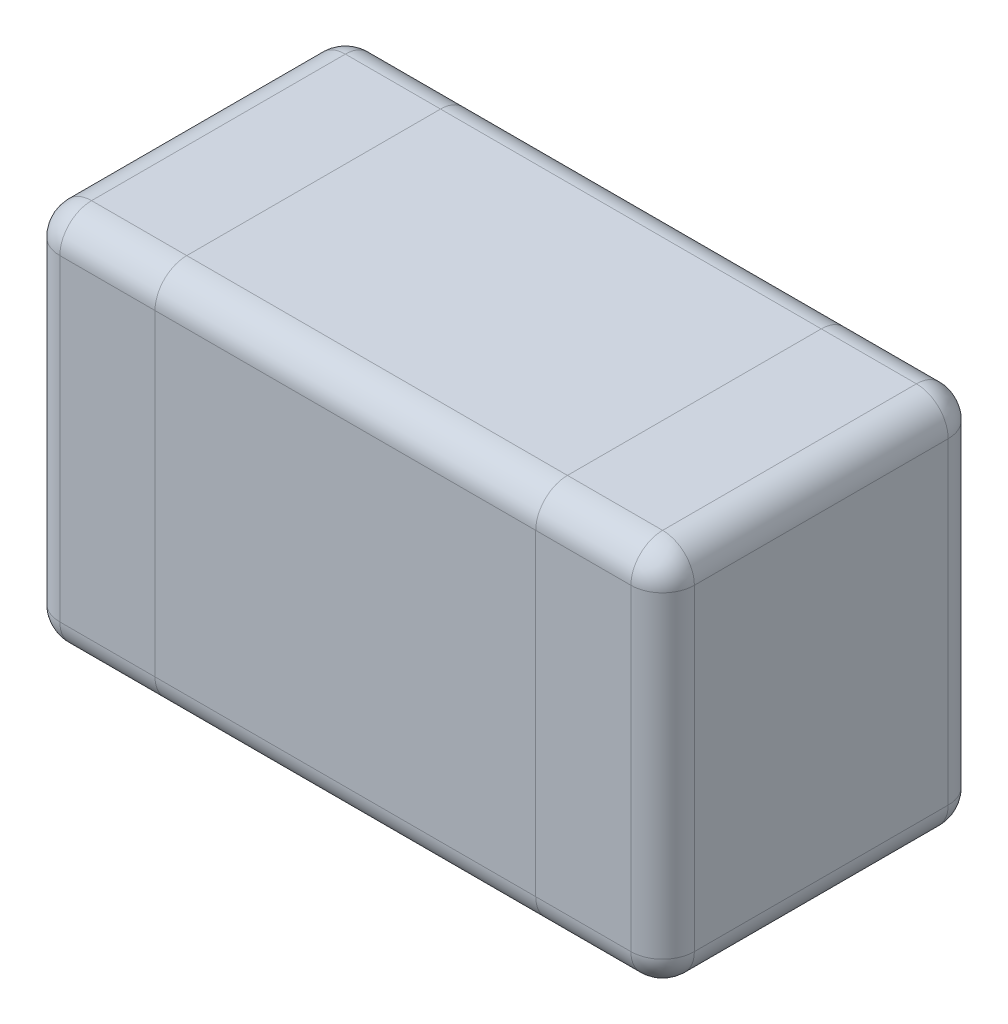
ISO-10303-21;
HEADER;
FILE_DESCRIPTION(('STEP AP214'),'2;1');
FILE_NAME('part.step','',(''),(''),'','','');
FILE_SCHEMA(('AUTOMOTIVE_DESIGN { 1 0 10303 214 1 1 1 1 }'));
ENDSEC;
DATA;
#1=APPLICATION_CONTEXT('core data for automotive mechanical design processes');
#2=APPLICATION_PROTOCOL_DEFINITION('international standard','automotive_design',2000,#1);
#3=PRODUCT_CONTEXT('',#1,'mechanical');
#4=PRODUCT('Part','Part','',(#3));
#5=PRODUCT_RELATED_PRODUCT_CATEGORY('part','',(#4));
#6=PRODUCT_DEFINITION_FORMATION('','',#4);
#7=PRODUCT_DEFINITION_CONTEXT('part definition',#1,'design');
#8=PRODUCT_DEFINITION('design','',#6,#7);
#9=PRODUCT_DEFINITION_SHAPE('','',#8);
#10=(LENGTH_UNIT() NAMED_UNIT(*) SI_UNIT(.MILLI.,.METRE.));
#11=(NAMED_UNIT(*) PLANE_ANGLE_UNIT() SI_UNIT($,.RADIAN.));
#12=(NAMED_UNIT(*) SI_UNIT($,.STERADIAN.) SOLID_ANGLE_UNIT());
#13=UNCERTAINTY_MEASURE_WITH_UNIT(LENGTH_MEASURE(1.E-05),#10,'distance_accuracy_value','');
#14=(GEOMETRIC_REPRESENTATION_CONTEXT(3) GLOBAL_UNCERTAINTY_ASSIGNED_CONTEXT((#13)) GLOBAL_UNIT_ASSIGNED_CONTEXT((#10,
#11,#12)) REPRESENTATION_CONTEXT('',''));
#15=CARTESIAN_POINT('',(0.,0.,0.));
#16=DIRECTION('',(0.,0.,1.));
#17=DIRECTION('',(1.,0.,0.));
#18=AXIS2_PLACEMENT_3D('',#15,#16,#17);
#19=CARTESIAN_POINT('',(0.500000000000004,0.6,-0.250000000000002));
#20=DIRECTION('',(0.,-1.,0.));
#21=DIRECTION('',(0.,0.,-1.));
#22=AXIS2_PLACEMENT_3D('',#19,#20,#21);
#23=PLANE('',#22);
#24=DIRECTION('',(0.,0.,1.));
#25=VECTOR('',#24,1.);
#26=CARTESIAN_POINT('',(-0.299999999999996,0.6,-0.250000000000002));
#27=LINE('',#26,#25);
#28=CARTESIAN_POINT('',(-0.299999999999996,0.6,-0.200000000000002));
#29=VERTEX_POINT('',#28);
#30=CARTESIAN_POINT('',(-0.299999999999996,0.6,0.199999999999998));
#31=VERTEX_POINT('',#30);
#32=EDGE_CURVE('E11',#29,#31,#27,.T.);
#33=ORIENTED_EDGE('',*,*,#32,.F.);
#34=DIRECTION('',(-1.,0.,0.));
#35=VECTOR('',#34,1.);
#36=CARTESIAN_POINT('',(0.500000000000004,0.6,-0.200000000000002));
#37=LINE('',#36,#35);
#38=CARTESIAN_POINT('',(-0.449999999999996,0.6,-0.200000000000002));
#39=VERTEX_POINT('',#38);
#40=EDGE_CURVE('E254',#29,#39,#37,.T.);
#41=ORIENTED_EDGE('',*,*,#40,.T.);
#42=DIRECTION('',(0.,0.,1.));
#43=VECTOR('',#42,1.);
#44=CARTESIAN_POINT('',(-0.449999999999996,0.6,-0.250000000000002));
#45=LINE('',#44,#43);
#46=CARTESIAN_POINT('',(-0.449999999999996,0.6,0.199999999999998));
#47=VERTEX_POINT('',#46);
#48=EDGE_CURVE('E257',#39,#47,#45,.T.);
#49=ORIENTED_EDGE('',*,*,#48,.T.);
#50=DIRECTION('',(1.,0.,0.));
#51=VECTOR('',#50,1.);
#52=CARTESIAN_POINT('',(0.500000000000004,0.6,0.199999999999998));
#53=LINE('',#52,#51);
#54=EDGE_CURVE('E261',#47,#31,#53,.T.);
#55=ORIENTED_EDGE('',*,*,#54,.T.);
#56=EDGE_LOOP('',(#33,#41,#49,#55));
#57=FACE_BOUND('',#56,.T.);
#58=ADVANCED_FACE('F38',(#57),#23,.F.);
#59=DIRECTION('',(0.,0.,-1.));
#60=VECTOR('',#59,1.);
#61=CARTESIAN_POINT('',(0.299999999999996,0.6,-0.250000000000002));
#62=LINE('',#61,#60);
#63=CARTESIAN_POINT('',(0.299999999999996,0.6,0.199999999999998));
#64=VERTEX_POINT('',#63);
#65=CARTESIAN_POINT('',(0.299999999999996,0.6,-0.200000000000002));
#66=VERTEX_POINT('',#65);
#67=EDGE_CURVE('E48',#64,#66,#62,.T.);
#68=ORIENTED_EDGE('',*,*,#67,.F.);
#69=CARTESIAN_POINT('',(0.450000000000004,0.6,0.199999999999998));
#70=VERTEX_POINT('',#69);
#71=EDGE_CURVE('E260',#64,#70,#53,.T.);
#72=ORIENTED_EDGE('',*,*,#71,.T.);
#73=DIRECTION('',(0.,0.,-1.));
#74=VECTOR('',#73,1.);
#75=CARTESIAN_POINT('',(0.450000000000004,0.6,-0.250000000000002));
#76=LINE('',#75,#74);
#77=CARTESIAN_POINT('',(0.450000000000004,0.6,-0.200000000000002));
#78=VERTEX_POINT('',#77);
#79=EDGE_CURVE('E251',#70,#78,#76,.T.);
#80=ORIENTED_EDGE('',*,*,#79,.T.);
#81=EDGE_CURVE('E255',#78,#66,#37,.T.);
#82=ORIENTED_EDGE('',*,*,#81,.T.);
#83=EDGE_LOOP('',(#68,#72,#80,#82));
#84=FACE_BOUND('',#83,.T.);
#85=ADVANCED_FACE('F527',(#84),#23,.F.);
#86=CARTESIAN_POINT('',(0.500000000000004,0.55,0.199999999999998));
#87=DIRECTION('',(1.,0.,0.));
#88=DIRECTION('',(0.,0.,-1.));
#89=AXIS2_PLACEMENT_3D('',#86,#87,#88);
#90=CYLINDRICAL_SURFACE('',#89,0.05);
#91=DIRECTION('',(1.,0.,0.));
#92=VECTOR('',#91,1.);
#93=CARTESIAN_POINT('',(-0.499999999999996,0.55,0.249999999999999));
#94=LINE('',#93,#92);
#95=CARTESIAN_POINT('',(-0.299999999999996,0.55,0.249999999999999));
#96=VERTEX_POINT('',#95);
#97=CARTESIAN_POINT('',(-0.449999999999996,0.55,0.249999999999999));
#98=VERTEX_POINT('',#97);
#99=EDGE_CURVE('E247',#96,#98,#94,.F.);
#100=ORIENTED_EDGE('',*,*,#99,.F.);
#101=CARTESIAN_POINT('',(-0.299999999999996,0.55,0.199999999999998));
#102=DIRECTION('',(1.,0.,0.));
#103=DIRECTION('',(0.,0.,-1.));
#104=AXIS2_PLACEMENT_3D('',#101,#102,#103);
#105=CIRCLE('',#104,0.05);
#106=EDGE_CURVE('E355',#96,#31,#105,.F.);
#107=ORIENTED_EDGE('',*,*,#106,.T.);
#108=ORIENTED_EDGE('',*,*,#54,.F.);
#109=CARTESIAN_POINT('',(-0.449999999999996,0.55,0.199999999999998));
#110=DIRECTION('',(-1.,0.,0.));
#111=DIRECTION('',(0.,0.,1.));
#112=AXIS2_PLACEMENT_3D('',#109,#110,#111);
#113=CIRCLE('',#112,0.05);
#114=EDGE_CURVE('E331',#47,#98,#113,.F.);
#115=ORIENTED_EDGE('',*,*,#114,.T.);
#116=EDGE_LOOP('',(#100,#107,#108,#115));
#117=FACE_BOUND('',#116,.T.);
#118=ADVANCED_FACE('F484',(#117),#90,.T.);
#119=ORIENTED_EDGE('',*,*,#71,.F.);
#120=CARTESIAN_POINT('',(0.299999999999996,0.55,0.199999999999998));
#121=DIRECTION('',(-1.,0.,0.));
#122=DIRECTION('',(0.,0.,1.));
#123=AXIS2_PLACEMENT_3D('',#120,#121,#122);
#124=CIRCLE('',#123,0.05);
#125=CARTESIAN_POINT('',(0.299999999999996,0.55,0.249999999999999));
#126=VERTEX_POINT('',#125);
#127=EDGE_CURVE('E354',#64,#126,#124,.F.);
#128=ORIENTED_EDGE('',*,*,#127,.T.);
#129=CARTESIAN_POINT('',(0.450000000000004,0.55,0.249999999999999));
#130=VERTEX_POINT('',#129);
#131=EDGE_CURVE('E248',#130,#126,#94,.F.);
#132=ORIENTED_EDGE('',*,*,#131,.F.);
#133=CARTESIAN_POINT('',(0.450000000000004,0.55,0.199999999999998));
#134=DIRECTION('',(1.,0.,0.));
#135=DIRECTION('',(0.,0.,-1.));
#136=AXIS2_PLACEMENT_3D('',#133,#134,#135);
#137=CIRCLE('',#136,0.05);
#138=EDGE_CURVE('E316',#70,#130,#137,.T.);
#139=ORIENTED_EDGE('',*,*,#138,.F.);
#140=EDGE_LOOP('',(#119,#128,#132,#139));
#141=FACE_BOUND('',#140,.T.);
#142=ADVANCED_FACE('F458',(#141),#90,.T.);
#143=CARTESIAN_POINT('',(-0.499999999999996,0.6,0.249999999999999));
#144=DIRECTION('',(0.,0.,-1.));
#145=DIRECTION('',(-1.,0.,0.));
#146=AXIS2_PLACEMENT_3D('',#143,#144,#145);
#147=PLANE('',#146);
#148=DIRECTION('',(0.,-1.,0.));
#149=VECTOR('',#148,1.);
#150=CARTESIAN_POINT('',(-0.299999999999996,0.6,0.249999999999999));
#151=LINE('',#150,#149);
#152=CARTESIAN_POINT('',(-0.299999999999996,0.05,0.249999999999999));
#153=VERTEX_POINT('',#152);
#154=EDGE_CURVE('E350',#96,#153,#151,.T.);
#155=ORIENTED_EDGE('',*,*,#154,.F.);
#156=ORIENTED_EDGE('',*,*,#99,.T.);
#157=DIRECTION('',(0.,-1.,0.));
#158=VECTOR('',#157,1.);
#159=CARTESIAN_POINT('',(-0.449999999999996,0.6,0.249999999999999));
#160=LINE('',#159,#158);
#161=CARTESIAN_POINT('',(-0.449999999999996,0.05,0.249999999999999));
#162=VERTEX_POINT('',#161);
#163=EDGE_CURVE('E244',#98,#162,#160,.T.);
#164=ORIENTED_EDGE('',*,*,#163,.T.);
#165=DIRECTION('',(1.,0.,0.));
#166=VECTOR('',#165,1.);
#167=CARTESIAN_POINT('',(0.500000000000004,0.05,0.249999999999999));
#168=LINE('',#167,#166);
#169=EDGE_CURVE('E238',#162,#153,#168,.T.);
#170=ORIENTED_EDGE('',*,*,#169,.T.);
#171=EDGE_LOOP('',(#155,#156,#164,#170));
#172=FACE_BOUND('',#171,.T.);
#173=ADVANCED_FACE('F472',(#172),#147,.F.);
#174=DIRECTION('',(0.,1.,0.));
#175=VECTOR('',#174,1.);
#176=CARTESIAN_POINT('',(0.299999999999996,0.6,0.249999999999999));
#177=LINE('',#176,#175);
#178=CARTESIAN_POINT('',(0.299999999999996,0.05,0.249999999999999));
#179=VERTEX_POINT('',#178);
#180=EDGE_CURVE('E346',#179,#126,#177,.T.);
#181=ORIENTED_EDGE('',*,*,#180,.F.);
#182=CARTESIAN_POINT('',(0.450000000000004,0.05,0.249999999999999));
#183=VERTEX_POINT('',#182);
#184=EDGE_CURVE('E237',#179,#183,#168,.T.);
#185=ORIENTED_EDGE('',*,*,#184,.T.);
#186=DIRECTION('',(0.,-1.,0.));
#187=VECTOR('',#186,1.);
#188=CARTESIAN_POINT('',(0.450000000000004,0.6,0.249999999999999));
#189=LINE('',#188,#187);
#190=EDGE_CURVE('E241',#183,#130,#189,.F.);
#191=ORIENTED_EDGE('',*,*,#190,.T.);
#192=ORIENTED_EDGE('',*,*,#131,.T.);
#193=EDGE_LOOP('',(#181,#185,#191,#192));
#194=FACE_BOUND('',#193,.T.);
#195=ADVANCED_FACE('F454',(#194),#147,.F.);
#196=CARTESIAN_POINT('',(-0.499999999999996,0.05,0.199999999999998));
#197=DIRECTION('',(-1.,0.,0.));
#198=DIRECTION('',(0.,0.,1.));
#199=AXIS2_PLACEMENT_3D('',#196,#197,#198);
#200=CYLINDRICAL_SURFACE('',#199,0.05);
#201=DIRECTION('',(1.,0.,0.));
#202=VECTOR('',#201,1.);
#203=CARTESIAN_POINT('',(-0.499999999999996,0.,0.199999999999998));
#204=LINE('',#203,#202);
#205=CARTESIAN_POINT('',(-0.299999999999996,0.,0.199999999999998));
#206=VERTEX_POINT('',#205);
#207=CARTESIAN_POINT('',(-0.449999999999996,0.,0.199999999999998));
#208=VERTEX_POINT('',#207);
#209=EDGE_CURVE('E267',#206,#208,#204,.F.);
#210=ORIENTED_EDGE('',*,*,#209,.F.);
#211=CARTESIAN_POINT('',(-0.299999999999996,0.05,0.199999999999998));
#212=DIRECTION('',(1.,0.,0.));
#213=DIRECTION('',(0.,0.,-1.));
#214=AXIS2_PLACEMENT_3D('',#211,#212,#213);
#215=CIRCLE('',#214,0.05);
#216=EDGE_CURVE('E351',#206,#153,#215,.F.);
#217=ORIENTED_EDGE('',*,*,#216,.T.);
#218=ORIENTED_EDGE('',*,*,#169,.F.);
#219=CARTESIAN_POINT('',(-0.449999999999996,0.05,0.199999999999998));
#220=DIRECTION('',(-1.,0.,0.));
#221=DIRECTION('',(0.,0.,1.));
#222=AXIS2_PLACEMENT_3D('',#219,#220,#221);
#223=CIRCLE('',#222,0.05);
#224=EDGE_CURVE('E322',#162,#208,#223,.F.);
#225=ORIENTED_EDGE('',*,*,#224,.T.);
#226=EDGE_LOOP('',(#210,#217,#218,#225));
#227=FACE_BOUND('',#226,.T.);
#228=ADVANCED_FACE('F510',(#227),#200,.T.);
#229=ORIENTED_EDGE('',*,*,#184,.F.);
#230=CARTESIAN_POINT('',(0.299999999999996,0.05,0.199999999999998));
#231=DIRECTION('',(-1.,0.,0.));
#232=DIRECTION('',(0.,0.,1.));
#233=AXIS2_PLACEMENT_3D('',#230,#231,#232);
#234=CIRCLE('',#233,0.05);
#235=CARTESIAN_POINT('',(0.299999999999996,0.,0.199999999999998));
#236=VERTEX_POINT('',#235);
#237=EDGE_CURVE('E366',#179,#236,#234,.F.);
#238=ORIENTED_EDGE('',*,*,#237,.T.);
#239=CARTESIAN_POINT('',(0.450000000000004,0.,0.199999999999998));
#240=VERTEX_POINT('',#239);
#241=EDGE_CURVE('E268',#240,#236,#204,.F.);
#242=ORIENTED_EDGE('',*,*,#241,.F.);
#243=CARTESIAN_POINT('',(0.450000000000004,0.05,0.199999999999998));
#244=DIRECTION('',(1.,0.,0.));
#245=DIRECTION('',(0.,0.,-1.));
#246=AXIS2_PLACEMENT_3D('',#243,#244,#245);
#247=CIRCLE('',#246,0.05);
#248=EDGE_CURVE('E302',#183,#240,#247,.T.);
#249=ORIENTED_EDGE('',*,*,#248,.F.);
#250=EDGE_LOOP('',(#229,#238,#242,#249));
#251=FACE_BOUND('',#250,.T.);
#252=ADVANCED_FACE('F444',(#251),#200,.T.);
#253=CARTESIAN_POINT('',(0.500000000000004,0.,-0.250000000000002));
#254=DIRECTION('',(0.,-1.,0.));
#255=DIRECTION('',(0.,0.,-1.));
#256=AXIS2_PLACEMENT_3D('',#253,#254,#255);
#257=PLANE('',#256);
#258=DIRECTION('',(-1.,0.,0.));
#259=VECTOR('',#258,1.);
#260=CARTESIAN_POINT('',(0.500000000000004,0.,-0.200000000000002));
#261=LINE('',#260,#259);
#262=CARTESIAN_POINT('',(-0.449999999999996,0.,-0.200000000000002));
#263=VERTEX_POINT('',#262);
#264=CARTESIAN_POINT('',(-0.299999999999996,0.,-0.200000000000002));
#265=VERTEX_POINT('',#264);
#266=EDGE_CURVE('E275',#263,#265,#261,.F.);
#267=ORIENTED_EDGE('',*,*,#266,.T.);
#268=DIRECTION('',(0.,0.,1.));
#269=VECTOR('',#268,1.);
#270=CARTESIAN_POINT('',(-0.299999999999996,0.,-0.250000000000002));
#271=LINE('',#270,#269);
#272=EDGE_CURVE('E367',#265,#206,#271,.T.);
#273=ORIENTED_EDGE('',*,*,#272,.T.);
#274=ORIENTED_EDGE('',*,*,#209,.T.);
#275=DIRECTION('',(0.,0.,1.));
#276=VECTOR('',#275,1.);
#277=CARTESIAN_POINT('',(-0.449999999999996,0.,-0.250000000000002));
#278=LINE('',#277,#276);
#279=EDGE_CURVE('E271',#208,#263,#278,.F.);
#280=ORIENTED_EDGE('',*,*,#279,.T.);
#281=EDGE_LOOP('',(#267,#273,#274,#280));
#282=FACE_BOUND('',#281,.T.);
#283=ADVANCED_FACE('F513',(#282),#257,.T.);
#284=ORIENTED_EDGE('',*,*,#241,.T.);
#285=DIRECTION('',(0.,0.,-1.));
#286=VECTOR('',#285,1.);
#287=CARTESIAN_POINT('',(0.299999999999996,0.,-0.250000000000002));
#288=LINE('',#287,#286);
#289=CARTESIAN_POINT('',(0.299999999999996,0.,-0.200000000000002));
#290=VERTEX_POINT('',#289);
#291=EDGE_CURVE('E361',#236,#290,#288,.T.);
#292=ORIENTED_EDGE('',*,*,#291,.T.);
#293=CARTESIAN_POINT('',(0.450000000000004,0.,-0.200000000000002));
#294=VERTEX_POINT('',#293);
#295=EDGE_CURVE('E274',#290,#294,#261,.F.);
#296=ORIENTED_EDGE('',*,*,#295,.T.);
#297=DIRECTION('',(0.,0.,-1.));
#298=VECTOR('',#297,1.);
#299=CARTESIAN_POINT('',(0.450000000000004,0.,0.249999999999999));
#300=LINE('',#299,#298);
#301=EDGE_CURVE('E264',#294,#240,#300,.F.);
#302=ORIENTED_EDGE('',*,*,#301,.T.);
#303=EDGE_LOOP('',(#284,#292,#296,#302));
#304=FACE_BOUND('',#303,.T.);
#305=ADVANCED_FACE('F388',(#304),#257,.T.);
#306=CARTESIAN_POINT('',(0.500000000000004,0.55,-0.200000000000002));
#307=DIRECTION('',(-1.,0.,0.));
#308=DIRECTION('',(0.,0.,1.));
#309=AXIS2_PLACEMENT_3D('',#306,#307,#308);
#310=CYLINDRICAL_SURFACE('',#309,0.05);
#311=ORIENTED_EDGE('',*,*,#40,.F.);
#312=CARTESIAN_POINT('',(-0.299999999999996,0.55,-0.200000000000002));
#313=DIRECTION('',(1.,0.,0.));
#314=DIRECTION('',(0.,0.,-1.));
#315=AXIS2_PLACEMENT_3D('',#312,#313,#314);
#316=CIRCLE('',#315,0.05);
#317=CARTESIAN_POINT('',(-0.299999999999996,0.55,-0.250000000000002));
#318=VERTEX_POINT('',#317);
#319=EDGE_CURVE('E358',#29,#318,#316,.F.);
#320=ORIENTED_EDGE('',*,*,#319,.T.);
#321=DIRECTION('',(-1.,0.,0.));
#322=VECTOR('',#321,1.);
#323=CARTESIAN_POINT('',(-0.499999999999996,0.55,-0.250000000000002));
#324=LINE('',#323,#322);
#325=CARTESIAN_POINT('',(-0.449999999999996,0.55,-0.250000000000002));
#326=VERTEX_POINT('',#325);
#327=EDGE_CURVE('E217',#326,#318,#324,.F.);
#328=ORIENTED_EDGE('',*,*,#327,.F.);
#329=CARTESIAN_POINT('',(-0.449999999999996,0.55,-0.200000000000002));
#330=DIRECTION('',(-1.,0.,0.));
#331=DIRECTION('',(0.,0.,1.));
#332=AXIS2_PLACEMENT_3D('',#329,#330,#331);
#333=CIRCLE('',#332,0.05);
#334=EDGE_CURVE('E293',#326,#39,#333,.F.);
#335=ORIENTED_EDGE('',*,*,#334,.T.);
#336=EDGE_LOOP('',(#311,#320,#328,#335));
#337=FACE_BOUND('',#336,.T.);
#338=ADVANCED_FACE('F520',(#337),#310,.T.);
#339=CARTESIAN_POINT('',(0.299999999999996,0.55,-0.250000000000002));
#340=VERTEX_POINT('',#339);
#341=CARTESIAN_POINT('',(0.450000000000004,0.55,-0.250000000000002));
#342=VERTEX_POINT('',#341);
#343=EDGE_CURVE('E212',#340,#342,#324,.F.);
#344=ORIENTED_EDGE('',*,*,#343,.F.);
#345=CARTESIAN_POINT('',(0.299999999999996,0.55,-0.200000000000002));
#346=DIRECTION('',(-1.,0.,0.));
#347=DIRECTION('',(0.,0.,1.));
#348=AXIS2_PLACEMENT_3D('',#345,#346,#347);
#349=CIRCLE('',#348,0.05);
#350=EDGE_CURVE('E362',#340,#66,#349,.F.);
#351=ORIENTED_EDGE('',*,*,#350,.T.);
#352=ORIENTED_EDGE('',*,*,#81,.F.);
#353=CARTESIAN_POINT('',(0.450000000000004,0.55,-0.200000000000002));
#354=DIRECTION('',(1.,0.,0.));
#355=DIRECTION('',(0.,0.,-1.));
#356=AXIS2_PLACEMENT_3D('',#353,#354,#355);
#357=CIRCLE('',#356,0.05);
#358=EDGE_CURVE('E197',#342,#78,#357,.T.);
#359=ORIENTED_EDGE('',*,*,#358,.F.);
#360=EDGE_LOOP('',(#344,#351,#352,#359));
#361=FACE_BOUND('',#360,.T.);
#362=ADVANCED_FACE('F423',(#361),#310,.T.);
#363=CARTESIAN_POINT('',(-0.499999999999996,0.05,-0.200000000000002));
#364=DIRECTION('',(1.,0.,0.));
#365=DIRECTION('',(0.,0.,-1.));
#366=AXIS2_PLACEMENT_3D('',#363,#364,#365);
#367=CYLINDRICAL_SURFACE('',#366,0.05);
#368=DIRECTION('',(-1.,0.,0.));
#369=VECTOR('',#368,1.);
#370=CARTESIAN_POINT('',(-0.499999999999996,0.05,-0.250000000000002));
#371=LINE('',#370,#369);
#372=CARTESIAN_POINT('',(-0.299999999999996,0.05,-0.250000000000002));
#373=VERTEX_POINT('',#372);
#374=CARTESIAN_POINT('',(-0.449999999999996,0.05,-0.250000000000002));
#375=VERTEX_POINT('',#374);
#376=EDGE_CURVE('E209',#373,#375,#371,.T.);
#377=ORIENTED_EDGE('',*,*,#376,.F.);
#378=CARTESIAN_POINT('',(-0.299999999999996,0.05,-0.200000000000002));
#379=DIRECTION('',(1.,0.,0.));
#380=DIRECTION('',(0.,0.,-1.));
#381=AXIS2_PLACEMENT_3D('',#378,#379,#380);
#382=CIRCLE('',#381,0.05);
#383=EDGE_CURVE('E371',#373,#265,#382,.F.);
#384=ORIENTED_EDGE('',*,*,#383,.T.);
#385=ORIENTED_EDGE('',*,*,#266,.F.);
#386=CARTESIAN_POINT('',(-0.449999999999996,0.05,-0.200000000000002));
#387=DIRECTION('',(-1.,0.,0.));
#388=DIRECTION('',(0.,0.,1.));
#389=AXIS2_PLACEMENT_3D('',#386,#387,#388);
#390=CIRCLE('',#389,0.05);
#391=EDGE_CURVE('E290',#263,#375,#390,.F.);
#392=ORIENTED_EDGE('',*,*,#391,.T.);
#393=EDGE_LOOP('',(#377,#384,#385,#392));
#394=FACE_BOUND('',#393,.T.);
#395=ADVANCED_FACE('F406',(#394),#367,.T.);
#396=ORIENTED_EDGE('',*,*,#295,.F.);
#397=CARTESIAN_POINT('',(0.299999999999996,0.05,-0.200000000000002));
#398=DIRECTION('',(-1.,0.,0.));
#399=DIRECTION('',(0.,0.,1.));
#400=AXIS2_PLACEMENT_3D('',#397,#398,#399);
#401=CIRCLE('',#400,0.05);
#402=CARTESIAN_POINT('',(0.299999999999996,0.05,-0.250000000000002));
#403=VERTEX_POINT('',#402);
#404=EDGE_CURVE('E42',#290,#403,#401,.F.);
#405=ORIENTED_EDGE('',*,*,#404,.T.);
#406=CARTESIAN_POINT('',(0.450000000000004,0.05,-0.250000000000002));
#407=VERTEX_POINT('',#406);
#408=EDGE_CURVE('E200',#407,#403,#371,.T.);
#409=ORIENTED_EDGE('',*,*,#408,.F.);
#410=CARTESIAN_POINT('',(0.450000000000004,0.05,-0.200000000000002));
#411=DIRECTION('',(1.,0.,0.));
#412=DIRECTION('',(0.,0.,-1.));
#413=AXIS2_PLACEMENT_3D('',#410,#411,#412);
#414=CIRCLE('',#413,0.05);
#415=EDGE_CURVE('E189',#294,#407,#414,.T.);
#416=ORIENTED_EDGE('',*,*,#415,.F.);
#417=EDGE_LOOP('',(#396,#405,#409,#416));
#418=FACE_BOUND('',#417,.T.);
#419=ADVANCED_FACE('F201',(#418),#367,.T.);
#420=CARTESIAN_POINT('',(-0.499999999999996,0.6,-0.250000000000002));
#421=DIRECTION('',(0.,0.,1.));
#422=DIRECTION('',(1.,0.,0.));
#423=AXIS2_PLACEMENT_3D('',#420,#421,#422);
#424=PLANE('',#423);
#425=DIRECTION('',(0.,1.,0.));
#426=VECTOR('',#425,1.);
#427=CARTESIAN_POINT('',(-0.299999999999996,0.6,-0.250000000000002));
#428=LINE('',#427,#426);
#429=EDGE_CURVE('E342',#373,#318,#428,.T.);
#430=ORIENTED_EDGE('',*,*,#429,.F.);
#431=ORIENTED_EDGE('',*,*,#376,.T.);
#432=DIRECTION('',(0.,-1.,0.));
#433=VECTOR('',#432,1.);
#434=CARTESIAN_POINT('',(-0.449999999999996,0.6,-0.250000000000002));
#435=LINE('',#434,#433);
#436=EDGE_CURVE('E206',#375,#326,#435,.F.);
#437=ORIENTED_EDGE('',*,*,#436,.T.);
#438=ORIENTED_EDGE('',*,*,#327,.T.);
#439=EDGE_LOOP('',(#430,#431,#437,#438));
#440=FACE_BOUND('',#439,.T.);
#441=ADVANCED_FACE('F409',(#440),#424,.F.);
#442=DIRECTION('',(0.,-1.,0.));
#443=VECTOR('',#442,1.);
#444=CARTESIAN_POINT('',(0.299999999999996,0.6,-0.250000000000002));
#445=LINE('',#444,#443);
#446=EDGE_CURVE('E277',#340,#403,#445,.T.);
#447=ORIENTED_EDGE('',*,*,#446,.F.);
#448=ORIENTED_EDGE('',*,*,#343,.T.);
#449=DIRECTION('',(0.,-1.,0.));
#450=VECTOR('',#449,1.);
#451=CARTESIAN_POINT('',(0.450000000000004,0.6,-0.250000000000002));
#452=LINE('',#451,#450);
#453=EDGE_CURVE('E181',#342,#407,#452,.T.);
#454=ORIENTED_EDGE('',*,*,#453,.T.);
#455=ORIENTED_EDGE('',*,*,#408,.T.);
#456=EDGE_LOOP('',(#447,#448,#454,#455));
#457=FACE_BOUND('',#456,.T.);
#458=ADVANCED_FACE('F210',(#457),#424,.F.);
#459=CARTESIAN_POINT('',(0.500000000000004,0.6,0.249999999999999));
#460=DIRECTION('',(-1.,0.,0.));
#461=DIRECTION('',(0.,0.,1.));
#462=AXIS2_PLACEMENT_3D('',#459,#460,#461);
#463=PLANE('',#462);
#464=DIRECTION('',(0.,-1.,0.));
#465=VECTOR('',#464,1.);
#466=CARTESIAN_POINT('',(0.500000000000004,0.6,-0.200000000000002));
#467=LINE('',#466,#465);
#468=CARTESIAN_POINT('',(0.500000000000004,0.05,-0.200000000000002));
#469=VERTEX_POINT('',#468);
#470=CARTESIAN_POINT('',(0.500000000000004,0.55,-0.200000000000002));
#471=VERTEX_POINT('',#470);
#472=EDGE_CURVE('E183',#469,#471,#467,.F.);
#473=ORIENTED_EDGE('',*,*,#472,.T.);
#474=DIRECTION('',(0.,0.,-1.));
#475=VECTOR('',#474,1.);
#476=CARTESIAN_POINT('',(0.500000000000004,0.55,0.249999999999999));
#477=LINE('',#476,#475);
#478=CARTESIAN_POINT('',(0.500000000000004,0.55,0.199999999999998));
#479=VERTEX_POINT('',#478);
#480=EDGE_CURVE('E226',#471,#479,#477,.F.);
#481=ORIENTED_EDGE('',*,*,#480,.T.);
#482=DIRECTION('',(0.,-1.,0.));
#483=VECTOR('',#482,1.);
#484=CARTESIAN_POINT('',(0.500000000000004,0.6,0.199999999999998));
#485=LINE('',#484,#483);
#486=CARTESIAN_POINT('',(0.500000000000004,0.05,0.199999999999998));
#487=VERTEX_POINT('',#486);
#488=EDGE_CURVE('E223',#479,#487,#485,.T.);
#489=ORIENTED_EDGE('',*,*,#488,.T.);
#490=DIRECTION('',(0.,0.,-1.));
#491=VECTOR('',#490,1.);
#492=CARTESIAN_POINT('',(0.500000000000004,0.05,-0.250000000000002));
#493=LINE('',#492,#491);
#494=EDGE_CURVE('E221',#487,#469,#493,.T.);
#495=ORIENTED_EDGE('',*,*,#494,.T.);
#496=EDGE_LOOP('',(#473,#481,#489,#495));
#497=FACE_BOUND('',#496,.T.);
#498=ADVANCED_FACE('F435',(#497),#463,.F.);
#499=EDGE_CURVE('E207',#403,#373,#371,.T.);
#500=ORIENTED_EDGE('',*,*,#499,.T.);
#501=ORIENTED_EDGE('',*,*,#429,.T.);
#502=EDGE_CURVE('E215',#318,#340,#324,.F.);
#503=ORIENTED_EDGE('',*,*,#502,.T.);
#504=ORIENTED_EDGE('',*,*,#446,.T.);
#505=EDGE_LOOP('',(#500,#501,#503,#504));
#506=FACE_BOUND('',#505,.T.);
#507=ADVANCED_FACE('F415',(#506),#424,.F.);
#508=CARTESIAN_POINT('',(-0.499999999999996,0.6,0.249999999999999));
#509=DIRECTION('',(1.,0.,0.));
#510=DIRECTION('',(0.,0.,-1.));
#511=AXIS2_PLACEMENT_3D('',#508,#509,#510);
#512=PLANE('',#511);
#513=DIRECTION('',(0.,-1.,0.));
#514=VECTOR('',#513,1.);
#515=CARTESIAN_POINT('',(-0.499999999999996,0.6,0.199999999999998));
#516=LINE('',#515,#514);
#517=CARTESIAN_POINT('',(-0.499999999999996,0.05,0.199999999999998));
#518=VERTEX_POINT('',#517);
#519=CARTESIAN_POINT('',(-0.499999999999996,0.55,0.199999999999998));
#520=VERTEX_POINT('',#519);
#521=EDGE_CURVE('E230',#518,#520,#516,.F.);
#522=ORIENTED_EDGE('',*,*,#521,.T.);
#523=DIRECTION('',(0.,0.,1.));
#524=VECTOR('',#523,1.);
#525=CARTESIAN_POINT('',(-0.499999999999996,0.55,0.249999999999999));
#526=LINE('',#525,#524);
#527=CARTESIAN_POINT('',(-0.499999999999996,0.55,-0.200000000000002));
#528=VERTEX_POINT('',#527);
#529=EDGE_CURVE('E235',#520,#528,#526,.F.);
#530=ORIENTED_EDGE('',*,*,#529,.T.);
#531=DIRECTION('',(0.,-1.,0.));
#532=VECTOR('',#531,1.);
#533=CARTESIAN_POINT('',(-0.499999999999996,0.6,-0.200000000000002));
#534=LINE('',#533,#532);
#535=CARTESIAN_POINT('',(-0.499999999999996,0.05,-0.200000000000002));
#536=VERTEX_POINT('',#535);
#537=EDGE_CURVE('E232',#528,#536,#534,.T.);
#538=ORIENTED_EDGE('',*,*,#537,.T.);
#539=DIRECTION('',(0.,0.,1.));
#540=VECTOR('',#539,1.);
#541=CARTESIAN_POINT('',(-0.499999999999996,0.05,0.249999999999999));
#542=LINE('',#541,#540);
#543=EDGE_CURVE('E228',#536,#518,#542,.T.);
#544=ORIENTED_EDGE('',*,*,#543,.T.);
#545=EDGE_LOOP('',(#522,#530,#538,#544));
#546=FACE_BOUND('',#545,.T.);
#547=ADVANCED_FACE('F492',(#546),#512,.F.);
#548=EDGE_CURVE('E252',#126,#96,#94,.F.);
#549=ORIENTED_EDGE('',*,*,#548,.T.);
#550=ORIENTED_EDGE('',*,*,#154,.T.);
#551=EDGE_CURVE('E242',#153,#179,#168,.T.);
#552=ORIENTED_EDGE('',*,*,#551,.T.);
#553=ORIENTED_EDGE('',*,*,#180,.T.);
#554=EDGE_LOOP('',(#549,#550,#552,#553));
#555=FACE_BOUND('',#554,.T.);
#556=ADVANCED_FACE('F465',(#555),#147,.F.);
#557=EDGE_CURVE('E258',#66,#29,#37,.T.);
#558=ORIENTED_EDGE('',*,*,#557,.T.);
#559=ORIENTED_EDGE('',*,*,#32,.T.);
#560=EDGE_CURVE('E265',#31,#64,#53,.T.);
#561=ORIENTED_EDGE('',*,*,#560,.T.);
#562=ORIENTED_EDGE('',*,*,#67,.T.);
#563=EDGE_LOOP('',(#558,#559,#561,#562));
#564=FACE_BOUND('',#563,.T.);
#565=ADVANCED_FACE('F525',(#564),#23,.F.);
#566=ORIENTED_EDGE('',*,*,#272,.F.);
#567=EDGE_CURVE('E278',#265,#290,#261,.F.);
#568=ORIENTED_EDGE('',*,*,#567,.T.);
#569=ORIENTED_EDGE('',*,*,#291,.F.);
#570=EDGE_CURVE('E272',#236,#206,#204,.F.);
#571=ORIENTED_EDGE('',*,*,#570,.T.);
#572=EDGE_LOOP('',(#566,#568,#569,#571));
#573=FACE_BOUND('',#572,.T.);
#574=ADVANCED_FACE('F400',(#573),#257,.T.);
#575=CARTESIAN_POINT('',(-0.449999999999996,0.6,0.199999999999998));
#576=DIRECTION('',(0.,-1.,0.));
#577=DIRECTION('',(0.,0.,-1.));
#578=AXIS2_PLACEMENT_3D('',#575,#576,#577);
#579=CYLINDRICAL_SURFACE('',#578,0.05);
#580=CARTESIAN_POINT('',(-0.449999999999996,0.55,0.199999999999998));
#581=DIRECTION('',(0.,1.,0.));
#582=DIRECTION('',(0.,0.,1.));
#583=AXIS2_PLACEMENT_3D('',#580,#581,#582);
#584=CIRCLE('',#583,0.05);
#585=EDGE_CURVE('E337',#520,#98,#584,.T.);
#586=ORIENTED_EDGE('',*,*,#585,.F.);
#587=ORIENTED_EDGE('',*,*,#521,.F.);
#588=CARTESIAN_POINT('',(-0.449999999999996,0.05,0.199999999999998));
#589=DIRECTION('',(0.,-1.,0.));
#590=DIRECTION('',(0.,0.,-1.));
#591=AXIS2_PLACEMENT_3D('',#588,#589,#590);
#592=CIRCLE('',#591,0.05);
#593=EDGE_CURVE('E334',#162,#518,#592,.T.);
#594=ORIENTED_EDGE('',*,*,#593,.F.);
#595=ORIENTED_EDGE('',*,*,#163,.F.);
#596=EDGE_LOOP('',(#586,#587,#594,#595));
#597=FACE_BOUND('',#596,.T.);
#598=ADVANCED_FACE('F40',(#597),#579,.T.);
#599=CARTESIAN_POINT('',(-0.449999999999996,0.55,0.199999999999998));
#600=DIRECTION('',(0.,0.,1.));
#601=DIRECTION('',(1.,0.,0.));
#602=AXIS2_PLACEMENT_3D('',#599,#600,#601);
#603=SPHERICAL_SURFACE('',#602,0.05);
#604=CARTESIAN_POINT('',(-0.449999999999996,0.55,0.199999999999998));
#605=DIRECTION('',(0.,0.,1.));
#606=DIRECTION('',(1.,0.,0.));
#607=AXIS2_PLACEMENT_3D('',#604,#605,#606);
#608=CIRCLE('',#607,0.05);
#609=EDGE_CURVE('E328',#520,#47,#608,.F.);
#610=ORIENTED_EDGE('',*,*,#609,.F.);
#611=ORIENTED_EDGE('',*,*,#585,.T.);
#612=ORIENTED_EDGE('',*,*,#114,.F.);
#613=EDGE_LOOP('',(#610,#611,#612));
#614=FACE_BOUND('',#613,.T.);
#615=ADVANCED_FACE('F481',(#614),#603,.T.);
#616=CARTESIAN_POINT('',(-0.449999999999996,0.05,0.199999999999998));
#617=DIRECTION('',(0.,0.,1.));
#618=DIRECTION('',(1.,0.,0.));
#619=AXIS2_PLACEMENT_3D('',#616,#617,#618);
#620=SPHERICAL_SURFACE('',#619,0.05);
#621=ORIENTED_EDGE('',*,*,#224,.F.);
#622=ORIENTED_EDGE('',*,*,#593,.T.);
#623=CARTESIAN_POINT('',(-0.449999999999996,0.05,0.199999999999998));
#624=DIRECTION('',(0.,0.,1.));
#625=DIRECTION('',(1.,0.,0.));
#626=AXIS2_PLACEMENT_3D('',#623,#624,#625);
#627=CIRCLE('',#626,0.05);
#628=EDGE_CURVE('E325',#208,#518,#627,.F.);
#629=ORIENTED_EDGE('',*,*,#628,.F.);
#630=EDGE_LOOP('',(#621,#622,#629));
#631=FACE_BOUND('',#630,.T.);
#632=ADVANCED_FACE('F508',(#631),#620,.T.);
#633=ORIENTED_EDGE('',*,*,#106,.F.);
#634=ORIENTED_EDGE('',*,*,#548,.F.);
#635=ORIENTED_EDGE('',*,*,#127,.F.);
#636=ORIENTED_EDGE('',*,*,#560,.F.);
#637=EDGE_LOOP('',(#633,#634,#635,#636));
#638=FACE_BOUND('',#637,.T.);
#639=ADVANCED_FACE('F467',(#638),#90,.T.);
#640=CARTESIAN_POINT('',(-0.449999999999996,0.55,-0.250000000000002));
#641=DIRECTION('',(0.,0.,1.));
#642=DIRECTION('',(1.,0.,0.));
#643=AXIS2_PLACEMENT_3D('',#640,#641,#642);
#644=CYLINDRICAL_SURFACE('',#643,0.05);
#645=ORIENTED_EDGE('',*,*,#609,.T.);
#646=ORIENTED_EDGE('',*,*,#48,.F.);
#647=CARTESIAN_POINT('',(-0.449999999999996,0.55,-0.200000000000002));
#648=DIRECTION('',(0.,0.,-1.));
#649=DIRECTION('',(0.,1.,0.));
#650=AXIS2_PLACEMENT_3D('',#647,#648,#649);
#651=CIRCLE('',#650,0.05);
#652=EDGE_CURVE('E313',#528,#39,#651,.T.);
#653=ORIENTED_EDGE('',*,*,#652,.F.);
#654=ORIENTED_EDGE('',*,*,#529,.F.);
#655=EDGE_LOOP('',(#645,#646,#653,#654));
#656=FACE_BOUND('',#655,.T.);
#657=ADVANCED_FACE('F489',(#656),#644,.T.);
#658=CARTESIAN_POINT('',(-0.449999999999996,0.6,-0.200000000000002));
#659=DIRECTION('',(0.,-1.,0.));
#660=DIRECTION('',(0.,0.,-1.));
#661=AXIS2_PLACEMENT_3D('',#658,#659,#660);
#662=CYLINDRICAL_SURFACE('',#661,0.05);
#663=CARTESIAN_POINT('',(-0.449999999999996,0.05,-0.200000000000002));
#664=DIRECTION('',(0.,-1.,0.));
#665=DIRECTION('',(0.,0.,-1.));
#666=AXIS2_PLACEMENT_3D('',#663,#664,#665);
#667=CIRCLE('',#666,0.05);
#668=EDGE_CURVE('E307',#536,#375,#667,.T.);
#669=ORIENTED_EDGE('',*,*,#668,.F.);
#670=ORIENTED_EDGE('',*,*,#537,.F.);
#671=CARTESIAN_POINT('',(-0.449999999999996,0.55,-0.200000000000002));
#672=DIRECTION('',(0.,1.,0.));
#673=DIRECTION('',(0.,0.,1.));
#674=AXIS2_PLACEMENT_3D('',#671,#672,#673);
#675=CIRCLE('',#674,0.05);
#676=EDGE_CURVE('E310',#326,#528,#675,.T.);
#677=ORIENTED_EDGE('',*,*,#676,.F.);
#678=ORIENTED_EDGE('',*,*,#436,.F.);
#679=EDGE_LOOP('',(#669,#670,#677,#678));
#680=FACE_BOUND('',#679,.T.);
#681=ADVANCED_FACE('F496',(#680),#662,.T.);
#682=CARTESIAN_POINT('',(-0.449999999999996,0.05,0.249999999999999));
#683=DIRECTION('',(0.,0.,-1.));
#684=DIRECTION('',(-1.,0.,0.));
#685=AXIS2_PLACEMENT_3D('',#682,#683,#684);
#686=CYLINDRICAL_SURFACE('',#685,0.05);
#687=ORIENTED_EDGE('',*,*,#628,.T.);
#688=ORIENTED_EDGE('',*,*,#543,.F.);
#689=CARTESIAN_POINT('',(-0.449999999999996,0.05,-0.200000000000002));
#690=DIRECTION('',(0.,0.,-1.));
#691=DIRECTION('',(-1.,0.,0.));
#692=AXIS2_PLACEMENT_3D('',#689,#690,#691);
#693=CIRCLE('',#692,0.05);
#694=EDGE_CURVE('E305',#263,#536,#693,.T.);
#695=ORIENTED_EDGE('',*,*,#694,.F.);
#696=ORIENTED_EDGE('',*,*,#279,.F.);
#697=EDGE_LOOP('',(#687,#688,#695,#696));
#698=FACE_BOUND('',#697,.T.);
#699=ADVANCED_FACE('F503',(#698),#686,.T.);
#700=ORIENTED_EDGE('',*,*,#216,.F.);
#701=ORIENTED_EDGE('',*,*,#570,.F.);
#702=ORIENTED_EDGE('',*,*,#237,.F.);
#703=ORIENTED_EDGE('',*,*,#551,.F.);
#704=EDGE_LOOP('',(#700,#701,#702,#703));
#705=FACE_BOUND('',#704,.T.);
#706=ADVANCED_FACE('F512',(#705),#200,.T.);
#707=CARTESIAN_POINT('',(0.450000000000004,0.6,0.199999999999998));
#708=DIRECTION('',(0.,-1.,0.));
#709=DIRECTION('',(0.,0.,-1.));
#710=AXIS2_PLACEMENT_3D('',#707,#708,#709);
#711=CYLINDRICAL_SURFACE('',#710,0.05);
#712=CARTESIAN_POINT('',(0.450000000000004,0.55,0.199999999999998));
#713=DIRECTION('',(0.,1.,0.));
#714=DIRECTION('',(0.,0.,1.));
#715=AXIS2_PLACEMENT_3D('',#712,#713,#714);
#716=CIRCLE('',#715,0.05);
#717=EDGE_CURVE('E319',#130,#479,#716,.T.);
#718=ORIENTED_EDGE('',*,*,#717,.F.);
#719=ORIENTED_EDGE('',*,*,#190,.F.);
#720=CARTESIAN_POINT('',(0.450000000000004,0.05,0.199999999999998));
#721=DIRECTION('',(0.,-1.,0.));
#722=DIRECTION('',(0.,0.,-1.));
#723=AXIS2_PLACEMENT_3D('',#720,#721,#722);
#724=CIRCLE('',#723,0.05);
#725=EDGE_CURVE('E299',#487,#183,#724,.T.);
#726=ORIENTED_EDGE('',*,*,#725,.F.);
#727=ORIENTED_EDGE('',*,*,#488,.F.);
#728=EDGE_LOOP('',(#718,#719,#726,#727));
#729=FACE_BOUND('',#728,.T.);
#730=ADVANCED_FACE('F451',(#729),#711,.T.);
#731=CARTESIAN_POINT('',(0.450000000000004,0.55,0.199999999999998));
#732=DIRECTION('',(0.,0.,1.));
#733=DIRECTION('',(1.,0.,0.));
#734=AXIS2_PLACEMENT_3D('',#731,#732,#733);
#735=SPHERICAL_SURFACE('',#734,0.05);
#736=ORIENTED_EDGE('',*,*,#138,.T.);
#737=ORIENTED_EDGE('',*,*,#717,.T.);
#738=CARTESIAN_POINT('',(0.450000000000004,0.55,0.199999999999998));
#739=DIRECTION('',(0.,0.,1.));
#740=DIRECTION('',(0.,-1.,0.));
#741=AXIS2_PLACEMENT_3D('',#738,#739,#740);
#742=CIRCLE('',#741,0.05);
#743=EDGE_CURVE('E296',#70,#479,#742,.F.);
#744=ORIENTED_EDGE('',*,*,#743,.F.);
#745=EDGE_LOOP('',(#736,#737,#744));
#746=FACE_BOUND('',#745,.T.);
#747=ADVANCED_FACE('F536',(#746),#735,.T.);
#748=CARTESIAN_POINT('',(-0.449999999999996,0.55,-0.200000000000002));
#749=DIRECTION('',(0.,0.,1.));
#750=DIRECTION('',(1.,0.,0.));
#751=AXIS2_PLACEMENT_3D('',#748,#749,#750);
#752=SPHERICAL_SURFACE('',#751,0.05);
#753=ORIENTED_EDGE('',*,*,#676,.T.);
#754=ORIENTED_EDGE('',*,*,#652,.T.);
#755=ORIENTED_EDGE('',*,*,#334,.F.);
#756=EDGE_LOOP('',(#753,#754,#755));
#757=FACE_BOUND('',#756,.T.);
#758=ADVANCED_FACE('F538',(#757),#752,.T.);
#759=CARTESIAN_POINT('',(-0.449999999999996,0.05,-0.200000000000002));
#760=DIRECTION('',(0.,0.,1.));
#761=DIRECTION('',(1.,0.,0.));
#762=AXIS2_PLACEMENT_3D('',#759,#760,#761);
#763=SPHERICAL_SURFACE('',#762,0.05);
#764=ORIENTED_EDGE('',*,*,#694,.T.);
#765=ORIENTED_EDGE('',*,*,#668,.T.);
#766=ORIENTED_EDGE('',*,*,#391,.F.);
#767=EDGE_LOOP('',(#764,#765,#766));
#768=FACE_BOUND('',#767,.T.);
#769=ADVANCED_FACE('F544',(#768),#763,.T.);
#770=CARTESIAN_POINT('',(0.450000000000004,0.05,0.199999999999998));
#771=DIRECTION('',(0.,0.,1.));
#772=DIRECTION('',(1.,0.,0.));
#773=AXIS2_PLACEMENT_3D('',#770,#771,#772);
#774=SPHERICAL_SURFACE('',#773,0.05);
#775=ORIENTED_EDGE('',*,*,#725,.T.);
#776=ORIENTED_EDGE('',*,*,#248,.T.);
#777=CARTESIAN_POINT('',(0.450000000000004,0.05,0.199999999999998));
#778=DIRECTION('',(0.,0.,1.));
#779=DIRECTION('',(1.,0.,0.));
#780=AXIS2_PLACEMENT_3D('',#777,#778,#779);
#781=CIRCLE('',#780,0.05);
#782=EDGE_CURVE('E287',#487,#240,#781,.F.);
#783=ORIENTED_EDGE('',*,*,#782,.F.);
#784=EDGE_LOOP('',(#775,#776,#783));
#785=FACE_BOUND('',#784,.T.);
#786=ADVANCED_FACE('F447',(#785),#774,.T.);
#787=CARTESIAN_POINT('',(0.450000000000004,0.55,-0.250000000000002));
#788=DIRECTION('',(0.,0.,-1.));
#789=DIRECTION('',(-1.,0.,0.));
#790=AXIS2_PLACEMENT_3D('',#787,#788,#789);
#791=CYLINDRICAL_SURFACE('',#790,0.05);
#792=ORIENTED_EDGE('',*,*,#743,.T.);
#793=ORIENTED_EDGE('',*,*,#480,.F.);
#794=CARTESIAN_POINT('',(0.450000000000004,0.55,-0.200000000000002));
#795=DIRECTION('',(0.,0.,-1.));
#796=DIRECTION('',(-1.,0.,0.));
#797=AXIS2_PLACEMENT_3D('',#794,#795,#796);
#798=CIRCLE('',#797,0.05);
#799=EDGE_CURVE('E284',#78,#471,#798,.T.);
#800=ORIENTED_EDGE('',*,*,#799,.F.);
#801=ORIENTED_EDGE('',*,*,#79,.F.);
#802=EDGE_LOOP('',(#792,#793,#800,#801));
#803=FACE_BOUND('',#802,.T.);
#804=ADVANCED_FACE('F431',(#803),#791,.T.);
#805=ORIENTED_EDGE('',*,*,#319,.F.);
#806=ORIENTED_EDGE('',*,*,#557,.F.);
#807=ORIENTED_EDGE('',*,*,#350,.F.);
#808=ORIENTED_EDGE('',*,*,#502,.F.);
#809=EDGE_LOOP('',(#805,#806,#807,#808));
#810=FACE_BOUND('',#809,.T.);
#811=ADVANCED_FACE('F418',(#810),#310,.T.);
#812=ORIENTED_EDGE('',*,*,#383,.F.);
#813=ORIENTED_EDGE('',*,*,#499,.F.);
#814=ORIENTED_EDGE('',*,*,#404,.F.);
#815=ORIENTED_EDGE('',*,*,#567,.F.);
#816=EDGE_LOOP('',(#812,#813,#814,#815));
#817=FACE_BOUND('',#816,.T.);
#818=ADVANCED_FACE('F397',(#817),#367,.T.);
#819=CARTESIAN_POINT('',(0.450000000000004,0.05,0.249999999999999));
#820=DIRECTION('',(0.,0.,1.));
#821=DIRECTION('',(1.,0.,0.));
#822=AXIS2_PLACEMENT_3D('',#819,#820,#821);
#823=CYLINDRICAL_SURFACE('',#822,0.05);
#824=ORIENTED_EDGE('',*,*,#782,.T.);
#825=ORIENTED_EDGE('',*,*,#301,.F.);
#826=CARTESIAN_POINT('',(0.450000000000004,0.05,-0.200000000000002));
#827=DIRECTION('',(0.,0.,-1.));
#828=DIRECTION('',(-1.,0.,0.));
#829=AXIS2_PLACEMENT_3D('',#826,#827,#828);
#830=CIRCLE('',#829,0.05);
#831=EDGE_CURVE('E193',#469,#294,#830,.T.);
#832=ORIENTED_EDGE('',*,*,#831,.F.);
#833=ORIENTED_EDGE('',*,*,#494,.F.);
#834=EDGE_LOOP('',(#824,#825,#832,#833));
#835=FACE_BOUND('',#834,.T.);
#836=ADVANCED_FACE('F439',(#835),#823,.T.);
#837=CARTESIAN_POINT('',(0.450000000000004,0.55,-0.200000000000002));
#838=DIRECTION('',(0.,0.,1.));
#839=DIRECTION('',(1.,0.,0.));
#840=AXIS2_PLACEMENT_3D('',#837,#838,#839);
#841=SPHERICAL_SURFACE('',#840,0.05);
#842=ORIENTED_EDGE('',*,*,#358,.T.);
#843=ORIENTED_EDGE('',*,*,#799,.T.);
#844=CARTESIAN_POINT('',(0.450000000000004,0.55,-0.200000000000002));
#845=DIRECTION('',(0.,1.,0.));
#846=DIRECTION('',(0.,0.,1.));
#847=AXIS2_PLACEMENT_3D('',#844,#845,#846);
#848=CIRCLE('',#847,0.05);
#849=EDGE_CURVE('E186',#342,#471,#848,.F.);
#850=ORIENTED_EDGE('',*,*,#849,.F.);
#851=EDGE_LOOP('',(#842,#843,#850));
#852=FACE_BOUND('',#851,.T.);
#853=ADVANCED_FACE('F427',(#852),#841,.T.);
#854=CARTESIAN_POINT('',(0.450000000000004,0.05,-0.200000000000002));
#855=DIRECTION('',(0.,0.,1.));
#856=DIRECTION('',(1.,0.,0.));
#857=AXIS2_PLACEMENT_3D('',#854,#855,#856);
#858=SPHERICAL_SURFACE('',#857,0.05);
#859=ORIENTED_EDGE('',*,*,#831,.T.);
#860=ORIENTED_EDGE('',*,*,#415,.T.);
#861=CARTESIAN_POINT('',(0.450000000000004,0.05,-0.200000000000002));
#862=DIRECTION('',(0.,-1.,0.));
#863=DIRECTION('',(0.,0.,-1.));
#864=AXIS2_PLACEMENT_3D('',#861,#862,#863);
#865=CIRCLE('',#864,0.05);
#866=EDGE_CURVE('E177',#469,#407,#865,.F.);
#867=ORIENTED_EDGE('',*,*,#866,.F.);
#868=EDGE_LOOP('',(#859,#860,#867));
#869=FACE_BOUND('',#868,.T.);
#870=ADVANCED_FACE('F191',(#869),#858,.T.);
#871=CARTESIAN_POINT('',(0.450000000000004,0.6,-0.200000000000002));
#872=DIRECTION('',(0.,-1.,0.));
#873=DIRECTION('',(0.,0.,-1.));
#874=AXIS2_PLACEMENT_3D('',#871,#872,#873);
#875=CYLINDRICAL_SURFACE('',#874,0.05);
#876=ORIENTED_EDGE('',*,*,#849,.T.);
#877=ORIENTED_EDGE('',*,*,#472,.F.);
#878=ORIENTED_EDGE('',*,*,#866,.T.);
#879=ORIENTED_EDGE('',*,*,#453,.F.);
#880=EDGE_LOOP('',(#876,#877,#878,#879));
#881=FACE_BOUND('',#880,.T.);
#882=ADVANCED_FACE('F179',(#881),#875,.T.);
#883=CLOSED_SHELL('',(#58,#85,#118,#142,#173,#195,#228,#252,#283,#305,#338,#362,#395,#419,#441,
#458,#498,#507,#547,#556,#565,#574,#598,#615,#632,#639,#657,#681,#699,#706,#730,#747,#758,#769,
#786,#804,#811,#818,#836,#853,#870,#882));
#884=MANIFOLD_SOLID_BREP('B2',#883);
#885=ADVANCED_BREP_SHAPE_REPRESENTATION('',(#18,#884),#14);
#886=SHAPE_DEFINITION_REPRESENTATION(#9,#885);
ENDSEC;
END-ISO-10303-21;
